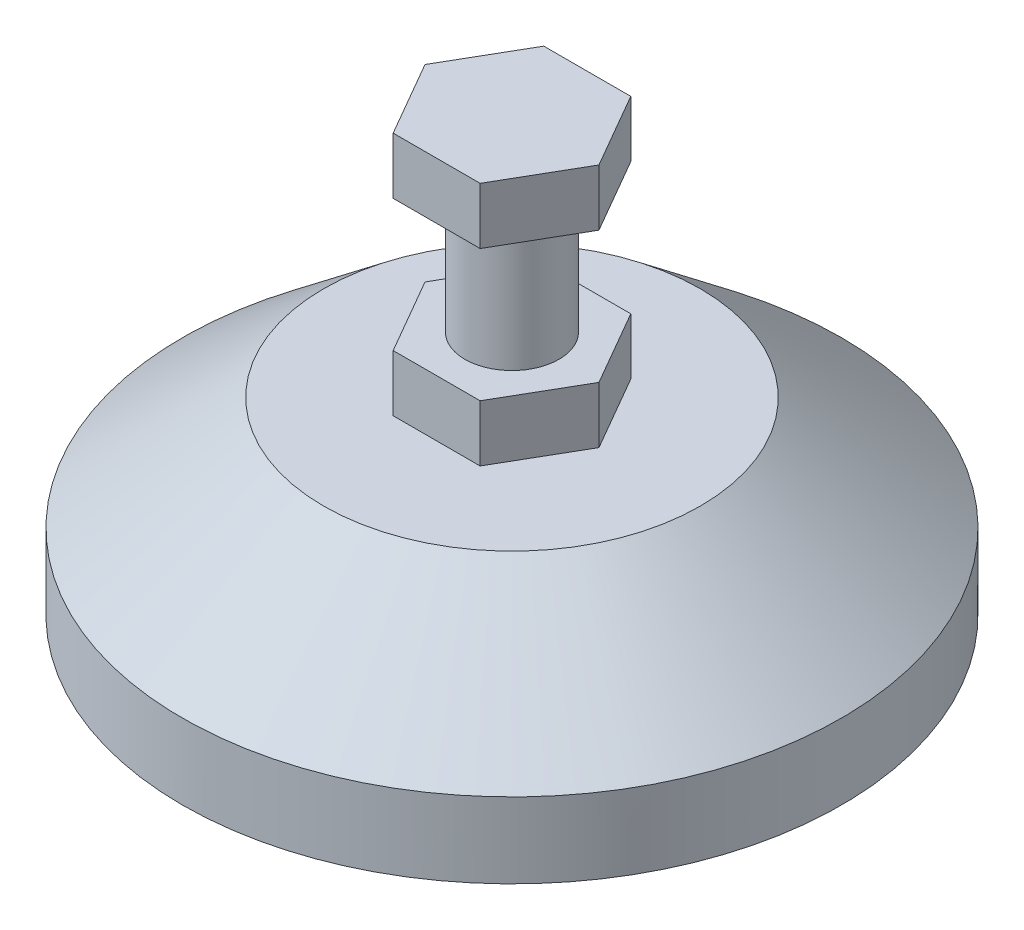
ISO-10303-21;
HEADER;
FILE_DESCRIPTION(('STEP AP214'),'2;1');
FILE_NAME('part.step','',(''),(''),'','','');
FILE_SCHEMA(('AUTOMOTIVE_DESIGN { 1 0 10303 214 1 1 1 1 }'));
ENDSEC;
DATA;
#1=APPLICATION_CONTEXT('core data for automotive mechanical design processes');
#2=APPLICATION_PROTOCOL_DEFINITION('international standard','automotive_design',2000,#1);
#3=PRODUCT_CONTEXT('',#1,'mechanical');
#4=PRODUCT('Part','Part','',(#3));
#5=PRODUCT_RELATED_PRODUCT_CATEGORY('part','',(#4));
#6=PRODUCT_DEFINITION_FORMATION('','',#4);
#7=PRODUCT_DEFINITION_CONTEXT('part definition',#1,'design');
#8=PRODUCT_DEFINITION('design','',#6,#7);
#9=PRODUCT_DEFINITION_SHAPE('','',#8);
#10=(LENGTH_UNIT() NAMED_UNIT(*) SI_UNIT(.MILLI.,.METRE.));
#11=(NAMED_UNIT(*) PLANE_ANGLE_UNIT() SI_UNIT($,.RADIAN.));
#12=(NAMED_UNIT(*) SI_UNIT($,.STERADIAN.) SOLID_ANGLE_UNIT());
#13=UNCERTAINTY_MEASURE_WITH_UNIT(LENGTH_MEASURE(1.E-05),#10,'distance_accuracy_value','');
#14=(GEOMETRIC_REPRESENTATION_CONTEXT(3) GLOBAL_UNCERTAINTY_ASSIGNED_CONTEXT((#13)) GLOBAL_UNIT_ASSIGNED_CONTEXT((#10,
#11,#12)) REPRESENTATION_CONTEXT('',''));
#15=CARTESIAN_POINT('',(0.,0.,0.));
#16=DIRECTION('',(0.,0.,1.));
#17=DIRECTION('',(1.,0.,0.));
#18=AXIS2_PLACEMENT_3D('',#15,#16,#17);
#19=CARTESIAN_POINT('',(4.618802153517,46.,8.));
#20=DIRECTION('',(-0.866025403784439,0.,-0.5));
#21=DIRECTION('',(-0.5,0.,0.866025403784439));
#22=AXIS2_PLACEMENT_3D('',#19,#20,#21);
#23=PLANE('',#22);
#24=DIRECTION('',(0.5,0.,-0.866025403784439));
#25=VECTOR('',#24,1.);
#26=CARTESIAN_POINT('',(4.618802153517,40.,8.));
#27=LINE('',#26,#25);
#28=CARTESIAN_POINT('',(4.618802153517,40.,8.));
#29=VERTEX_POINT('',#28);
#30=CARTESIAN_POINT('',(9.23760430703401,40.,0.));
#31=VERTEX_POINT('',#30);
#32=EDGE_CURVE('E147',#29,#31,#27,.T.);
#33=ORIENTED_EDGE('',*,*,#32,.T.);
#34=DIRECTION('',(0.,-1.,0.));
#35=VECTOR('',#34,1.);
#36=CARTESIAN_POINT('',(9.23760430703401,46.,0.));
#37=LINE('',#36,#35);
#38=CARTESIAN_POINT('',(9.23760430703401,46.,0.));
#39=VERTEX_POINT('',#38);
#40=EDGE_CURVE('E13',#39,#31,#37,.T.);
#41=ORIENTED_EDGE('',*,*,#40,.F.);
#42=DIRECTION('',(0.5,0.,-0.866025403784439));
#43=VECTOR('',#42,1.);
#44=CARTESIAN_POINT('',(4.618802153517,46.,8.));
#45=LINE('',#44,#43);
#46=CARTESIAN_POINT('',(4.618802153517,46.,8.));
#47=VERTEX_POINT('',#46);
#48=EDGE_CURVE('E163',#47,#39,#45,.T.);
#49=ORIENTED_EDGE('',*,*,#48,.F.);
#50=DIRECTION('',(0.,-1.,0.));
#51=VECTOR('',#50,1.);
#52=CARTESIAN_POINT('',(4.618802153517,46.,8.));
#53=LINE('',#52,#51);
#54=EDGE_CURVE('E143',#47,#29,#53,.T.);
#55=ORIENTED_EDGE('',*,*,#54,.T.);
#56=EDGE_LOOP('',(#33,#41,#49,#55));
#57=FACE_BOUND('',#56,.T.);
#58=ADVANCED_FACE('F57',(#57),#23,.F.);
#59=CARTESIAN_POINT('',(9.23760430703401,46.,0.));
#60=DIRECTION('',(-0.866025403784438,0.,0.5));
#61=DIRECTION('',(0.5,0.,0.866025403784438));
#62=AXIS2_PLACEMENT_3D('',#59,#60,#61);
#63=PLANE('',#62);
#64=DIRECTION('',(-0.5,0.,-0.866025403784438));
#65=VECTOR('',#64,1.);
#66=CARTESIAN_POINT('',(9.23760430703401,40.,0.));
#67=LINE('',#66,#65);
#68=CARTESIAN_POINT('',(4.618802153517,40.,-8.));
#69=VERTEX_POINT('',#68);
#70=EDGE_CURVE('E151',#31,#69,#67,.T.);
#71=ORIENTED_EDGE('',*,*,#70,.T.);
#72=DIRECTION('',(0.,-1.,0.));
#73=VECTOR('',#72,1.);
#74=CARTESIAN_POINT('',(4.618802153517,46.,-8.));
#75=LINE('',#74,#73);
#76=CARTESIAN_POINT('',(4.618802153517,46.,-8.));
#77=VERTEX_POINT('',#76);
#78=EDGE_CURVE('E66',#77,#69,#75,.T.);
#79=ORIENTED_EDGE('',*,*,#78,.F.);
#80=DIRECTION('',(-0.5,0.,-0.866025403784438));
#81=VECTOR('',#80,1.);
#82=CARTESIAN_POINT('',(9.23760430703401,46.,0.));
#83=LINE('',#82,#81);
#84=EDGE_CURVE('E111',#39,#77,#83,.T.);
#85=ORIENTED_EDGE('',*,*,#84,.F.);
#86=ORIENTED_EDGE('',*,*,#40,.T.);
#87=EDGE_LOOP('',(#71,#79,#85,#86));
#88=FACE_BOUND('',#87,.T.);
#89=ADVANCED_FACE('F192',(#88),#63,.F.);
#90=CARTESIAN_POINT('',(4.618802153517,46.,-8.));
#91=DIRECTION('',(0.,0.,1.));
#92=DIRECTION('',(1.,0.,0.));
#93=AXIS2_PLACEMENT_3D('',#90,#91,#92);
#94=PLANE('',#93);
#95=DIRECTION('',(-1.,0.,0.));
#96=VECTOR('',#95,1.);
#97=CARTESIAN_POINT('',(4.618802153517,40.,-8.));
#98=LINE('',#97,#96);
#99=CARTESIAN_POINT('',(-4.61880215351701,40.,-8.));
#100=VERTEX_POINT('',#99);
#101=EDGE_CURVE('E154',#69,#100,#98,.T.);
#102=ORIENTED_EDGE('',*,*,#101,.T.);
#103=DIRECTION('',(0.,-1.,0.));
#104=VECTOR('',#103,1.);
#105=CARTESIAN_POINT('',(-4.61880215351701,46.,-8.));
#106=LINE('',#105,#104);
#107=CARTESIAN_POINT('',(-4.61880215351701,46.,-8.));
#108=VERTEX_POINT('',#107);
#109=EDGE_CURVE('E135',#108,#100,#106,.T.);
#110=ORIENTED_EDGE('',*,*,#109,.F.);
#111=DIRECTION('',(-1.,0.,0.));
#112=VECTOR('',#111,1.);
#113=CARTESIAN_POINT('',(4.618802153517,46.,-8.));
#114=LINE('',#113,#112);
#115=EDGE_CURVE('E124',#77,#108,#114,.T.);
#116=ORIENTED_EDGE('',*,*,#115,.F.);
#117=ORIENTED_EDGE('',*,*,#78,.T.);
#118=EDGE_LOOP('',(#102,#110,#116,#117));
#119=FACE_BOUND('',#118,.T.);
#120=ADVANCED_FACE('F174',(#119),#94,.F.);
#121=CARTESIAN_POINT('',(-4.61880215351701,46.,-8.));
#122=DIRECTION('',(0.866025403784439,0.,0.5));
#123=DIRECTION('',(0.5,0.,-0.866025403784439));
#124=AXIS2_PLACEMENT_3D('',#121,#122,#123);
#125=PLANE('',#124);
#126=DIRECTION('',(-0.5,0.,0.866025403784439));
#127=VECTOR('',#126,1.);
#128=CARTESIAN_POINT('',(-4.61880215351701,40.,-8.));
#129=LINE('',#128,#127);
#130=CARTESIAN_POINT('',(-9.23760430703401,40.,0.));
#131=VERTEX_POINT('',#130);
#132=EDGE_CURVE('E133',#100,#131,#129,.T.);
#133=ORIENTED_EDGE('',*,*,#132,.T.);
#134=DIRECTION('',(0.,-1.,0.));
#135=VECTOR('',#134,1.);
#136=CARTESIAN_POINT('',(-9.23760430703401,46.,0.));
#137=LINE('',#136,#135);
#138=CARTESIAN_POINT('',(-9.23760430703401,46.,0.));
#139=VERTEX_POINT('',#138);
#140=EDGE_CURVE('E130',#139,#131,#137,.T.);
#141=ORIENTED_EDGE('',*,*,#140,.F.);
#142=DIRECTION('',(-0.5,0.,0.866025403784439));
#143=VECTOR('',#142,1.);
#144=CARTESIAN_POINT('',(-4.61880215351701,46.,-8.));
#145=LINE('',#144,#143);
#146=EDGE_CURVE('E118',#108,#139,#145,.T.);
#147=ORIENTED_EDGE('',*,*,#146,.F.);
#148=ORIENTED_EDGE('',*,*,#109,.T.);
#149=EDGE_LOOP('',(#133,#141,#147,#148));
#150=FACE_BOUND('',#149,.T.);
#151=ADVANCED_FACE('F131',(#150),#125,.F.);
#152=CARTESIAN_POINT('',(-9.23760430703401,46.,0.));
#153=DIRECTION('',(0.866025403784439,0.,-0.5));
#154=DIRECTION('',(-0.5,0.,-0.866025403784439));
#155=AXIS2_PLACEMENT_3D('',#152,#153,#154);
#156=PLANE('',#155);
#157=DIRECTION('',(0.5,0.,0.866025403784439));
#158=VECTOR('',#157,1.);
#159=CARTESIAN_POINT('',(-9.23760430703401,40.,0.));
#160=LINE('',#159,#158);
#161=CARTESIAN_POINT('',(-4.61880215351701,40.,8.));
#162=VERTEX_POINT('',#161);
#163=EDGE_CURVE('E97',#131,#162,#160,.T.);
#164=ORIENTED_EDGE('',*,*,#163,.T.);
#165=DIRECTION('',(0.,-1.,0.));
#166=VECTOR('',#165,1.);
#167=CARTESIAN_POINT('',(-4.61880215351701,46.,8.));
#168=LINE('',#167,#166);
#169=CARTESIAN_POINT('',(-4.61880215351701,46.,8.));
#170=VERTEX_POINT('',#169);
#171=EDGE_CURVE('E136',#170,#162,#168,.T.);
#172=ORIENTED_EDGE('',*,*,#171,.F.);
#173=DIRECTION('',(0.5,0.,0.866025403784439));
#174=VECTOR('',#173,1.);
#175=CARTESIAN_POINT('',(-9.23760430703401,46.,0.));
#176=LINE('',#175,#174);
#177=EDGE_CURVE('E122',#139,#170,#176,.T.);
#178=ORIENTED_EDGE('',*,*,#177,.F.);
#179=ORIENTED_EDGE('',*,*,#140,.T.);
#180=EDGE_LOOP('',(#164,#172,#178,#179));
#181=FACE_BOUND('',#180,.T.);
#182=ADVANCED_FACE('F138',(#181),#156,.F.);
#183=CARTESIAN_POINT('',(-4.61880215351701,46.,8.));
#184=DIRECTION('',(0.,0.,-1.));
#185=DIRECTION('',(-1.,0.,0.));
#186=AXIS2_PLACEMENT_3D('',#183,#184,#185);
#187=PLANE('',#186);
#188=DIRECTION('',(1.,0.,0.));
#189=VECTOR('',#188,1.);
#190=CARTESIAN_POINT('',(-4.61880215351701,40.,8.));
#191=LINE('',#190,#189);
#192=EDGE_CURVE('E103',#162,#29,#191,.T.);
#193=ORIENTED_EDGE('',*,*,#192,.T.);
#194=ORIENTED_EDGE('',*,*,#54,.F.);
#195=DIRECTION('',(1.,0.,0.));
#196=VECTOR('',#195,1.);
#197=CARTESIAN_POINT('',(-4.61880215351701,46.,8.));
#198=LINE('',#197,#196);
#199=EDGE_CURVE('E74',#170,#47,#198,.T.);
#200=ORIENTED_EDGE('',*,*,#199,.F.);
#201=ORIENTED_EDGE('',*,*,#171,.T.);
#202=EDGE_LOOP('',(#193,#194,#200,#201));
#203=FACE_BOUND('',#202,.T.);
#204=ADVANCED_FACE('F181',(#203),#187,.F.);
#205=CARTESIAN_POINT('',(0.,46.,0.));
#206=DIRECTION('',(0.,1.,0.));
#207=DIRECTION('',(0.,0.,1.));
#208=AXIS2_PLACEMENT_3D('',#205,#206,#207);
#209=PLANE('',#208);
#210=ORIENTED_EDGE('',*,*,#48,.T.);
#211=ORIENTED_EDGE('',*,*,#84,.T.);
#212=ORIENTED_EDGE('',*,*,#115,.T.);
#213=ORIENTED_EDGE('',*,*,#146,.T.);
#214=ORIENTED_EDGE('',*,*,#177,.T.);
#215=ORIENTED_EDGE('',*,*,#199,.T.);
#216=EDGE_LOOP('',(#210,#211,#212,#213,#214,#215));
#217=FACE_BOUND('',#216,.T.);
#218=ADVANCED_FACE('F120',(#217),#209,.T.);
#219=CARTESIAN_POINT('',(0.,40.,0.));
#220=DIRECTION('',(0.,1.,0.));
#221=DIRECTION('',(0.,0.,1.));
#222=AXIS2_PLACEMENT_3D('',#219,#220,#221);
#223=PLANE('',#222);
#224=ORIENTED_EDGE('',*,*,#32,.F.);
#225=ORIENTED_EDGE('',*,*,#192,.F.);
#226=ORIENTED_EDGE('',*,*,#163,.F.);
#227=ORIENTED_EDGE('',*,*,#132,.F.);
#228=ORIENTED_EDGE('',*,*,#101,.F.);
#229=ORIENTED_EDGE('',*,*,#70,.F.);
#230=EDGE_LOOP('',(#224,#225,#226,#227,#228,#229));
#231=FACE_BOUND('',#230,.T.);
#232=ADVANCED_FACE('F177',(#231),#223,.F.);
#233=CLOSED_SHELL('',(#58,#89,#120,#151,#182,#204,#218,#232));
#234=MANIFOLD_SOLID_BREP('B2_NOT_SHOWN',#233);
#235=CARTESIAN_POINT('',(0.,96.,0.));
#236=DIRECTION('',(0.,-1.,0.));
#237=DIRECTION('',(0.,0.,-1.));
#238=AXIS2_PLACEMENT_3D('',#235,#236,#237);
#239=CYLINDRICAL_SURFACE('',#238,5.);
#240=CARTESIAN_POINT('',(0.,26.,0.));
#241=DIRECTION('',(0.,1.,0.));
#242=DIRECTION('',(0.,0.,1.));
#243=AXIS2_PLACEMENT_3D('',#240,#241,#242);
#244=CIRCLE('',#243,5.);
#245=CARTESIAN_POINT('',(0.,26.,5.));
#246=VERTEX_POINT('',#245);
#247=EDGE_CURVE('E56',#246,#246,#244,.T.);
#248=ORIENTED_EDGE('',*,*,#247,.T.);
#249=EDGE_LOOP('',(#248));
#250=FACE_BOUND('',#249,.T.);
#251=CARTESIAN_POINT('',(0.,43.,0.));
#252=DIRECTION('',(0.,1.,0.));
#253=DIRECTION('',(0.,0.,1.));
#254=AXIS2_PLACEMENT_3D('',#251,#252,#253);
#255=CIRCLE('',#254,5.);
#256=CARTESIAN_POINT('',(0.,43.,5.));
#257=VERTEX_POINT('',#256);
#258=EDGE_CURVE('E297',#257,#257,#255,.T.);
#259=ORIENTED_EDGE('',*,*,#258,.F.);
#260=EDGE_LOOP('',(#259));
#261=FACE_BOUND('',#260,.T.);
#262=ADVANCED_FACE('F294',(#250,#261),#239,.T.);
#263=CARTESIAN_POINT('',(0.,26.,0.));
#264=DIRECTION('',(0.,1.,0.));
#265=DIRECTION('',(0.,0.,1.));
#266=AXIS2_PLACEMENT_3D('',#263,#264,#265);
#267=PLANE('',#266);
#268=ORIENTED_EDGE('',*,*,#247,.F.);
#269=EDGE_LOOP('',(#268));
#270=FACE_BOUND('',#269,.T.);
#271=ADVANCED_FACE('F313',(#270),#267,.F.);
#272=CARTESIAN_POINT('',(-32.8148806484654,43.,70.));
#273=DIRECTION('',(0.,1.,0.));
#274=DIRECTION('',(0.,0.,1.));
#275=AXIS2_PLACEMENT_3D('',#272,#273,#274);
#276=PLANE('',#275);
#277=ORIENTED_EDGE('',*,*,#258,.T.);
#278=EDGE_LOOP('',(#277));
#279=FACE_BOUND('',#278,.T.);
#280=ADVANCED_FACE('F310',(#279),#276,.T.);
#281=CLOSED_SHELL('',(#262,#271,#280));
#282=MANIFOLD_SOLID_BREP('B7',#281);
#283=CARTESIAN_POINT('',(4.61880215351695,26.,8.00000000000002));
#284=DIRECTION('',(-0.866025403784437,0.,-0.5));
#285=DIRECTION('',(-0.5,0.,0.866025403784437));
#286=AXIS2_PLACEMENT_3D('',#283,#284,#285);
#287=PLANE('',#286);
#288=DIRECTION('',(0.5,0.,-0.866025403784437));
#289=VECTOR('',#288,1.);
#290=CARTESIAN_POINT('',(4.61880215351695,20.,8.00000000000002));
#291=LINE('',#290,#289);
#292=CARTESIAN_POINT('',(4.61880215351695,20.,8.00000000000002));
#293=VERTEX_POINT('',#292);
#294=CARTESIAN_POINT('',(9.23760430703402,20.,0.));
#295=VERTEX_POINT('',#294);
#296=EDGE_CURVE('E441',#293,#295,#291,.T.);
#297=ORIENTED_EDGE('',*,*,#296,.T.);
#298=DIRECTION('',(0.,-1.,0.));
#299=VECTOR('',#298,1.);
#300=CARTESIAN_POINT('',(9.23760430703402,26.,0.));
#301=LINE('',#300,#299);
#302=CARTESIAN_POINT('',(9.23760430703402,26.,0.));
#303=VERTEX_POINT('',#302);
#304=EDGE_CURVE('E292',#303,#295,#301,.T.);
#305=ORIENTED_EDGE('',*,*,#304,.F.);
#306=DIRECTION('',(0.5,0.,-0.866025403784437));
#307=VECTOR('',#306,1.);
#308=CARTESIAN_POINT('',(4.61880215351695,26.,8.00000000000002));
#309=LINE('',#308,#307);
#310=CARTESIAN_POINT('',(4.61880215351695,26.,8.00000000000002));
#311=VERTEX_POINT('',#310);
#312=EDGE_CURVE('E457',#311,#303,#309,.T.);
#313=ORIENTED_EDGE('',*,*,#312,.F.);
#314=DIRECTION('',(0.,-1.,0.));
#315=VECTOR('',#314,1.);
#316=CARTESIAN_POINT('',(4.61880215351695,26.,8.00000000000002));
#317=LINE('',#316,#315);
#318=EDGE_CURVE('E437',#311,#293,#317,.T.);
#319=ORIENTED_EDGE('',*,*,#318,.T.);
#320=EDGE_LOOP('',(#297,#305,#313,#319));
#321=FACE_BOUND('',#320,.T.);
#322=ADVANCED_FACE('F351',(#321),#287,.F.);
#323=CARTESIAN_POINT('',(9.23760430703402,26.,0.));
#324=DIRECTION('',(-0.866025403784437,0.,0.5));
#325=DIRECTION('',(0.5,0.,0.866025403784437));
#326=AXIS2_PLACEMENT_3D('',#323,#324,#325);
#327=PLANE('',#326);
#328=DIRECTION('',(-0.5,0.,-0.866025403784438));
#329=VECTOR('',#328,1.);
#330=CARTESIAN_POINT('',(9.23760430703402,20.,0.));
#331=LINE('',#330,#329);
#332=CARTESIAN_POINT('',(4.61880215351698,20.,-7.99999999999998));
#333=VERTEX_POINT('',#332);
#334=EDGE_CURVE('E445',#295,#333,#331,.T.);
#335=ORIENTED_EDGE('',*,*,#334,.T.);
#336=DIRECTION('',(0.,-1.,0.));
#337=VECTOR('',#336,1.);
#338=CARTESIAN_POINT('',(4.61880215351698,26.,-7.99999999999998));
#339=LINE('',#338,#337);
#340=CARTESIAN_POINT('',(4.61880215351698,26.,-7.99999999999998));
#341=VERTEX_POINT('',#340);
#342=EDGE_CURVE('E360',#341,#333,#339,.T.);
#343=ORIENTED_EDGE('',*,*,#342,.F.);
#344=DIRECTION('',(-0.5,0.,-0.866025403784438));
#345=VECTOR('',#344,1.);
#346=CARTESIAN_POINT('',(9.23760430703402,26.,0.));
#347=LINE('',#346,#345);
#348=EDGE_CURVE('E405',#303,#341,#347,.T.);
#349=ORIENTED_EDGE('',*,*,#348,.F.);
#350=ORIENTED_EDGE('',*,*,#304,.T.);
#351=EDGE_LOOP('',(#335,#343,#349,#350));
#352=FACE_BOUND('',#351,.T.);
#353=ADVANCED_FACE('F486',(#352),#327,.F.);
#354=CARTESIAN_POINT('',(4.61880215351698,26.,-7.99999999999998));
#355=DIRECTION('',(0.,0.,1.));
#356=DIRECTION('',(1.,0.,0.));
#357=AXIS2_PLACEMENT_3D('',#354,#355,#356);
#358=PLANE('',#357);
#359=DIRECTION('',(-0.999999999999999,0.,0.));
#360=VECTOR('',#359,1.);
#361=CARTESIAN_POINT('',(4.61880215351698,20.,-7.99999999999998));
#362=LINE('',#361,#360);
#363=CARTESIAN_POINT('',(-4.61880215351723,20.,-8.00000000000006));
#364=VERTEX_POINT('',#363);
#365=EDGE_CURVE('E448',#333,#364,#362,.T.);
#366=ORIENTED_EDGE('',*,*,#365,.T.);
#367=DIRECTION('',(0.,-1.,0.));
#368=VECTOR('',#367,1.);
#369=CARTESIAN_POINT('',(-4.61880215351723,26.,-8.00000000000006));
#370=LINE('',#369,#368);
#371=CARTESIAN_POINT('',(-4.61880215351723,26.,-8.00000000000006));
#372=VERTEX_POINT('',#371);
#373=EDGE_CURVE('E429',#372,#364,#370,.T.);
#374=ORIENTED_EDGE('',*,*,#373,.F.);
#375=DIRECTION('',(-0.999999999999999,0.,0.));
#376=VECTOR('',#375,1.);
#377=CARTESIAN_POINT('',(4.61880215351698,26.,-7.99999999999998));
#378=LINE('',#377,#376);
#379=EDGE_CURVE('E418',#341,#372,#378,.T.);
#380=ORIENTED_EDGE('',*,*,#379,.F.);
#381=ORIENTED_EDGE('',*,*,#342,.T.);
#382=EDGE_LOOP('',(#366,#374,#380,#381));
#383=FACE_BOUND('',#382,.T.);
#384=ADVANCED_FACE('F468',(#383),#358,.F.);
#385=CARTESIAN_POINT('',(-4.61880215351723,26.,-8.00000000000006));
#386=DIRECTION('',(0.866025403784437,0.,0.5));
#387=DIRECTION('',(0.5,0.,-0.866025403784438));
#388=AXIS2_PLACEMENT_3D('',#385,#386,#387);
#389=PLANE('',#388);
#390=DIRECTION('',(-0.5,0.,0.866025403784438));
#391=VECTOR('',#390,1.);
#392=CARTESIAN_POINT('',(-4.61880215351723,20.,-8.00000000000006));
#393=LINE('',#392,#391);
#394=CARTESIAN_POINT('',(-9.23760430703419,20.,0.));
#395=VERTEX_POINT('',#394);
#396=EDGE_CURVE('E427',#364,#395,#393,.T.);
#397=ORIENTED_EDGE('',*,*,#396,.T.);
#398=DIRECTION('',(0.,-1.,0.));
#399=VECTOR('',#398,1.);
#400=CARTESIAN_POINT('',(-9.23760430703419,26.,0.));
#401=LINE('',#400,#399);
#402=CARTESIAN_POINT('',(-9.23760430703419,26.,0.));
#403=VERTEX_POINT('',#402);
#404=EDGE_CURVE('E424',#403,#395,#401,.T.);
#405=ORIENTED_EDGE('',*,*,#404,.F.);
#406=DIRECTION('',(-0.5,0.,0.866025403784438));
#407=VECTOR('',#406,1.);
#408=CARTESIAN_POINT('',(-4.61880215351723,26.,-8.00000000000006));
#409=LINE('',#408,#407);
#410=EDGE_CURVE('E412',#372,#403,#409,.T.);
#411=ORIENTED_EDGE('',*,*,#410,.F.);
#412=ORIENTED_EDGE('',*,*,#373,.T.);
#413=EDGE_LOOP('',(#397,#405,#411,#412));
#414=FACE_BOUND('',#413,.T.);
#415=ADVANCED_FACE('F425',(#414),#389,.F.);
#416=CARTESIAN_POINT('',(-9.23760430703419,26.,0.));
#417=DIRECTION('',(0.866025403784439,0.,-0.5));
#418=DIRECTION('',(-0.5,0.,-0.866025403784439));
#419=AXIS2_PLACEMENT_3D('',#416,#417,#418);
#420=PLANE('',#419);
#421=DIRECTION('',(0.5,0.,0.866025403784439));
#422=VECTOR('',#421,1.);
#423=CARTESIAN_POINT('',(-9.23760430703419,20.,0.));
#424=LINE('',#423,#422);
#425=CARTESIAN_POINT('',(-4.61880215351701,20.,7.99999999999998));
#426=VERTEX_POINT('',#425);
#427=EDGE_CURVE('E391',#395,#426,#424,.T.);
#428=ORIENTED_EDGE('',*,*,#427,.T.);
#429=DIRECTION('',(0.,-1.,0.));
#430=VECTOR('',#429,1.);
#431=CARTESIAN_POINT('',(-4.61880215351701,26.,7.99999999999998));
#432=LINE('',#431,#430);
#433=CARTESIAN_POINT('',(-4.61880215351701,26.,7.99999999999998));
#434=VERTEX_POINT('',#433);
#435=EDGE_CURVE('E430',#434,#426,#432,.T.);
#436=ORIENTED_EDGE('',*,*,#435,.F.);
#437=DIRECTION('',(0.5,0.,0.866025403784439));
#438=VECTOR('',#437,1.);
#439=CARTESIAN_POINT('',(-9.23760430703419,26.,0.));
#440=LINE('',#439,#438);
#441=EDGE_CURVE('E416',#403,#434,#440,.T.);
#442=ORIENTED_EDGE('',*,*,#441,.F.);
#443=ORIENTED_EDGE('',*,*,#404,.T.);
#444=EDGE_LOOP('',(#428,#436,#442,#443));
#445=FACE_BOUND('',#444,.T.);
#446=ADVANCED_FACE('F432',(#445),#420,.F.);
#447=CARTESIAN_POINT('',(-4.61880215351701,26.,7.99999999999998));
#448=DIRECTION('',(0.,0.,-1.));
#449=DIRECTION('',(-1.,0.,0.));
#450=AXIS2_PLACEMENT_3D('',#447,#448,#449);
#451=PLANE('',#450);
#452=DIRECTION('',(0.999999999999999,0.,0.));
#453=VECTOR('',#452,1.);
#454=CARTESIAN_POINT('',(-4.61880215351701,20.,7.99999999999998));
#455=LINE('',#454,#453);
#456=EDGE_CURVE('E397',#426,#293,#455,.T.);
#457=ORIENTED_EDGE('',*,*,#456,.T.);
#458=ORIENTED_EDGE('',*,*,#318,.F.);
#459=DIRECTION('',(0.999999999999999,0.,0.));
#460=VECTOR('',#459,1.);
#461=CARTESIAN_POINT('',(-4.61880215351701,26.,7.99999999999998));
#462=LINE('',#461,#460);
#463=EDGE_CURVE('E368',#434,#311,#462,.T.);
#464=ORIENTED_EDGE('',*,*,#463,.F.);
#465=ORIENTED_EDGE('',*,*,#435,.T.);
#466=EDGE_LOOP('',(#457,#458,#464,#465));
#467=FACE_BOUND('',#466,.T.);
#468=ADVANCED_FACE('F475',(#467),#451,.F.);
#469=CARTESIAN_POINT('',(0.,26.,0.));
#470=DIRECTION('',(0.,1.,0.));
#471=DIRECTION('',(0.,0.,1.));
#472=AXIS2_PLACEMENT_3D('',#469,#470,#471);
#473=PLANE('',#472);
#474=ORIENTED_EDGE('',*,*,#312,.T.);
#475=ORIENTED_EDGE('',*,*,#348,.T.);
#476=ORIENTED_EDGE('',*,*,#379,.T.);
#477=ORIENTED_EDGE('',*,*,#410,.T.);
#478=ORIENTED_EDGE('',*,*,#441,.T.);
#479=ORIENTED_EDGE('',*,*,#463,.T.);
#480=EDGE_LOOP('',(#474,#475,#476,#477,#478,#479));
#481=FACE_BOUND('',#480,.T.);
#482=ADVANCED_FACE('F414',(#481),#473,.T.);
#483=CARTESIAN_POINT('',(0.,20.,0.));
#484=DIRECTION('',(0.,1.,0.));
#485=DIRECTION('',(0.,0.,1.));
#486=AXIS2_PLACEMENT_3D('',#483,#484,#485);
#487=PLANE('',#486);
#488=ORIENTED_EDGE('',*,*,#296,.F.);
#489=ORIENTED_EDGE('',*,*,#456,.F.);
#490=ORIENTED_EDGE('',*,*,#427,.F.);
#491=ORIENTED_EDGE('',*,*,#396,.F.);
#492=ORIENTED_EDGE('',*,*,#365,.F.);
#493=ORIENTED_EDGE('',*,*,#334,.F.);
#494=EDGE_LOOP('',(#488,#489,#490,#491,#492,#493));
#495=FACE_BOUND('',#494,.T.);
#496=ADVANCED_FACE('F471',(#495),#487,.F.);
#497=CLOSED_SHELL('',(#322,#353,#384,#415,#446,#468,#482,#496));
#498=MANIFOLD_SOLID_BREP('B51',#497);
#499=CARTESIAN_POINT('',(0.,8.,0.));
#500=DIRECTION('',(0.,-1.,0.));
#501=DIRECTION('',(0.,0.,-1.));
#502=AXIS2_PLACEMENT_3D('',#499,#500,#501);
#503=CYLINDRICAL_SURFACE('',#502,35.);
#504=CARTESIAN_POINT('',(0.,8.,0.));
#505=DIRECTION('',(0.,-1.,0.));
#506=DIRECTION('',(0.,0.,-1.));
#507=AXIS2_PLACEMENT_3D('',#504,#505,#506);
#508=CIRCLE('',#507,35.);
#509=CARTESIAN_POINT('',(0.,8.,-35.));
#510=VERTEX_POINT('',#509);
#511=EDGE_CURVE('E350',#510,#510,#508,.F.);
#512=ORIENTED_EDGE('',*,*,#511,.F.);
#513=EDGE_LOOP('',(#512));
#514=FACE_BOUND('',#513,.T.);
#515=CARTESIAN_POINT('',(0.,0.,0.));
#516=DIRECTION('',(0.,1.,0.));
#517=DIRECTION('',(0.,0.,1.));
#518=AXIS2_PLACEMENT_3D('',#515,#516,#517);
#519=CIRCLE('',#518,35.);
#520=CARTESIAN_POINT('',(0.,0.,35.));
#521=VERTEX_POINT('',#520);
#522=EDGE_CURVE('E570',#521,#521,#519,.T.);
#523=ORIENTED_EDGE('',*,*,#522,.T.);
#524=EDGE_LOOP('',(#523));
#525=FACE_BOUND('',#524,.T.);
#526=ADVANCED_FACE('F562',(#514,#525),#503,.T.);
#527=CARTESIAN_POINT('',(0.,0.,0.));
#528=DIRECTION('',(0.,1.,0.));
#529=DIRECTION('',(0.,0.,1.));
#530=AXIS2_PLACEMENT_3D('',#527,#528,#529);
#531=PLANE('',#530);
#532=ORIENTED_EDGE('',*,*,#522,.F.);
#533=EDGE_LOOP('',(#532));
#534=FACE_BOUND('',#533,.T.);
#535=ADVANCED_FACE('F606',(#534),#531,.F.);
#536=CARTESIAN_POINT('',(0.,20.,0.));
#537=DIRECTION('',(0.,1.,0.));
#538=DIRECTION('',(0.,0.,1.));
#539=AXIS2_PLACEMENT_3D('',#536,#537,#538);
#540=PLANE('',#539);
#541=CARTESIAN_POINT('',(0.,20.,0.));
#542=DIRECTION('',(0.,1.,0.));
#543=DIRECTION('',(0.,0.,1.));
#544=AXIS2_PLACEMENT_3D('',#541,#542,#543);
#545=CIRCLE('',#544,20.);
#546=CARTESIAN_POINT('',(0.,20.,20.));
#547=VERTEX_POINT('',#546);
#548=EDGE_CURVE('E577',#547,#547,#545,.T.);
#549=ORIENTED_EDGE('',*,*,#548,.T.);
#550=EDGE_LOOP('',(#549));
#551=FACE_BOUND('',#550,.T.);
#552=ADVANCED_FACE('F588',(#551),#540,.T.);
#553=CARTESIAN_POINT('',(0.,20.,0.));
#554=DIRECTION('',(0.,-1.,0.));
#555=DIRECTION('',(0.,0.,-1.));
#556=AXIS2_PLACEMENT_3D('',#553,#554,#555);
#557=CONICAL_SURFACE('',#556,20.,0.896055384571344);
#558=ORIENTED_EDGE('',*,*,#511,.T.);
#559=EDGE_LOOP('',(#558));
#560=FACE_BOUND('',#559,.T.);
#561=ORIENTED_EDGE('',*,*,#548,.F.);
#562=EDGE_LOOP('',(#561));
#563=FACE_BOUND('',#562,.T.);
#564=ADVANCED_FACE('F605',(#560,#563),#557,.T.);
#565=CLOSED_SHELL('',(#526,#535,#552,#564));
#566=MANIFOLD_SOLID_BREP('B286',#565);
#567=ADVANCED_BREP_SHAPE_REPRESENTATION('',(#18,#234,#282,#498,#566),#14);
#568=SHAPE_DEFINITION_REPRESENTATION(#9,#567);
ENDSEC;
END-ISO-10303-21;
